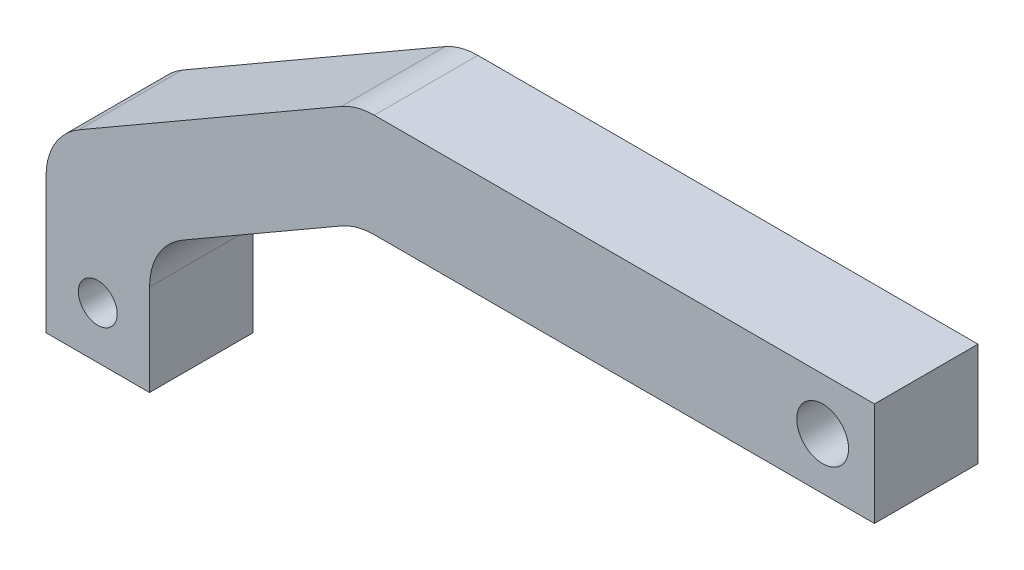
ISO-10303-21;
HEADER;
FILE_DESCRIPTION(('STEP AP214'),'2;1');
FILE_NAME('part.step','',(''),(''),'','','');
FILE_SCHEMA(('AUTOMOTIVE_DESIGN { 1 0 10303 214 1 1 1 1 }'));
ENDSEC;
DATA;
#1=APPLICATION_CONTEXT('core data for automotive mechanical design processes');
#2=APPLICATION_PROTOCOL_DEFINITION('international standard','automotive_design',2000,#1);
#3=PRODUCT_CONTEXT('',#1,'mechanical');
#4=PRODUCT('Part','Part','',(#3));
#5=PRODUCT_RELATED_PRODUCT_CATEGORY('part','',(#4));
#6=PRODUCT_DEFINITION_FORMATION('','',#4);
#7=PRODUCT_DEFINITION_CONTEXT('part definition',#1,'design');
#8=PRODUCT_DEFINITION('design','',#6,#7);
#9=PRODUCT_DEFINITION_SHAPE('','',#8);
#10=(LENGTH_UNIT() NAMED_UNIT(*) SI_UNIT(.MILLI.,.METRE.));
#11=(NAMED_UNIT(*) PLANE_ANGLE_UNIT() SI_UNIT($,.RADIAN.));
#12=(NAMED_UNIT(*) SI_UNIT($,.STERADIAN.) SOLID_ANGLE_UNIT());
#13=UNCERTAINTY_MEASURE_WITH_UNIT(LENGTH_MEASURE(1.E-05),#10,'distance_accuracy_value','');
#14=(GEOMETRIC_REPRESENTATION_CONTEXT(3) GLOBAL_UNCERTAINTY_ASSIGNED_CONTEXT((#13)) GLOBAL_UNIT_ASSIGNED_CONTEXT((#10,
#11,#12)) REPRESENTATION_CONTEXT('',''));
#15=CARTESIAN_POINT('',(0.,0.,0.));
#16=DIRECTION('',(0.,0.,1.));
#17=DIRECTION('',(1.,0.,0.));
#18=AXIS2_PLACEMENT_3D('',#15,#16,#17);
#19=CARTESIAN_POINT('',(-10.,0.,20.));
#20=DIRECTION('',(0.,1.,0.));
#21=DIRECTION('',(0.,0.,1.));
#22=AXIS2_PLACEMENT_3D('',#19,#20,#21);
#23=PLANE('',#22);
#24=DIRECTION('',(1.,0.,0.));
#25=VECTOR('',#24,1.);
#26=CARTESIAN_POINT('',(-10.,0.,0.));
#27=LINE('',#26,#25);
#28=CARTESIAN_POINT('',(-10.,0.,0.));
#29=VERTEX_POINT('',#28);
#30=CARTESIAN_POINT('',(10.,0.,0.));
#31=VERTEX_POINT('',#30);
#32=EDGE_CURVE('E146',#29,#31,#27,.T.);
#33=ORIENTED_EDGE('',*,*,#32,.T.);
#34=DIRECTION('',(0.,0.,-1.));
#35=VECTOR('',#34,1.);
#36=CARTESIAN_POINT('',(10.,0.,20.));
#37=LINE('',#36,#35);
#38=CARTESIAN_POINT('',(10.,0.,20.));
#39=VERTEX_POINT('',#38);
#40=EDGE_CURVE('E128',#39,#31,#37,.T.);
#41=ORIENTED_EDGE('',*,*,#40,.F.);
#42=DIRECTION('',(1.,0.,0.));
#43=VECTOR('',#42,1.);
#44=CARTESIAN_POINT('',(-10.,0.,20.));
#45=LINE('',#44,#43);
#46=CARTESIAN_POINT('',(-10.,0.,20.));
#47=VERTEX_POINT('',#46);
#48=EDGE_CURVE('E134',#47,#39,#45,.T.);
#49=ORIENTED_EDGE('',*,*,#48,.F.);
#50=DIRECTION('',(0.,0.,-1.));
#51=VECTOR('',#50,1.);
#52=CARTESIAN_POINT('',(-10.,0.,20.));
#53=LINE('',#52,#51);
#54=EDGE_CURVE('E207',#47,#29,#53,.T.);
#55=ORIENTED_EDGE('',*,*,#54,.T.);
#56=EDGE_LOOP('',(#33,#41,#49,#55));
#57=FACE_BOUND('',#56,.T.);
#58=ADVANCED_FACE('F34',(#57),#23,.F.);
#59=CARTESIAN_POINT('',(10.,0.,20.));
#60=DIRECTION('',(-1.,0.,0.));
#61=DIRECTION('',(0.,-1.,0.));
#62=AXIS2_PLACEMENT_3D('',#59,#60,#61);
#63=PLANE('',#62);
#64=DIRECTION('',(0.,1.,0.));
#65=VECTOR('',#64,1.);
#66=CARTESIAN_POINT('',(10.,0.,0.));
#67=LINE('',#66,#65);
#68=CARTESIAN_POINT('',(10.,17.6676515812917,0.));
#69=VERTEX_POINT('',#68);
#70=EDGE_CURVE('E186',#31,#69,#67,.T.);
#71=ORIENTED_EDGE('',*,*,#70,.T.);
#72=DIRECTION('',(0.,0.,-1.));
#73=VECTOR('',#72,1.);
#74=CARTESIAN_POINT('',(10.,17.6676515812917,20.));
#75=LINE('',#74,#73);
#76=CARTESIAN_POINT('',(10.,17.6676515812917,20.));
#77=VERTEX_POINT('',#76);
#78=EDGE_CURVE('E131',#69,#77,#75,.F.);
#79=ORIENTED_EDGE('',*,*,#78,.T.);
#80=DIRECTION('',(0.,1.,0.));
#81=VECTOR('',#80,1.);
#82=CARTESIAN_POINT('',(10.,0.,20.));
#83=LINE('',#82,#81);
#84=EDGE_CURVE('E123',#39,#77,#83,.T.);
#85=ORIENTED_EDGE('',*,*,#84,.F.);
#86=ORIENTED_EDGE('',*,*,#40,.T.);
#87=EDGE_LOOP('',(#71,#79,#85,#86));
#88=FACE_BOUND('',#87,.T.);
#89=ADVANCED_FACE('F126',(#88),#63,.F.);
#90=CARTESIAN_POINT('',(10.,25.,20.));
#91=DIRECTION('',(-0.499999999999998,0.86602540378444,0.));
#92=DIRECTION('',(-0.86602540378444,-0.499999999999998,0.));
#93=AXIS2_PLACEMENT_3D('',#90,#91,#92);
#94=PLANE('',#93);
#95=DIRECTION('',(0.86602540378444,0.499999999999998,0.));
#96=VECTOR('',#95,1.);
#97=CARTESIAN_POINT('',(10.,25.,0.));
#98=LINE('',#97,#96);
#99=CARTESIAN_POINT('',(16.35,28.6661742093541,0.));
#100=VERTEX_POINT('',#99);
#101=CARTESIAN_POINT('',(47.0529547438753,46.3925333956473,0.));
#102=VERTEX_POINT('',#101);
#103=EDGE_CURVE('E188',#100,#102,#98,.T.);
#104=ORIENTED_EDGE('',*,*,#103,.T.);
#105=DIRECTION('',(0.,0.,-1.));
#106=VECTOR('',#105,1.);
#107=CARTESIAN_POINT('',(47.0529547438753,46.3925333956473,20.));
#108=LINE('',#107,#106);
#109=CARTESIAN_POINT('',(47.0529547438753,46.3925333956473,20.));
#110=VERTEX_POINT('',#109);
#111=EDGE_CURVE('E177',#102,#110,#108,.F.);
#112=ORIENTED_EDGE('',*,*,#111,.T.);
#113=DIRECTION('',(0.86602540378444,0.499999999999998,0.));
#114=VECTOR('',#113,1.);
#115=CARTESIAN_POINT('',(10.,25.,20.));
#116=LINE('',#115,#114);
#117=CARTESIAN_POINT('',(16.35,28.6661742093541,20.));
#118=VERTEX_POINT('',#117);
#119=EDGE_CURVE('E133',#118,#110,#116,.T.);
#120=ORIENTED_EDGE('',*,*,#119,.F.);
#121=DIRECTION('',(0.,0.,-1.));
#122=VECTOR('',#121,1.);
#123=CARTESIAN_POINT('',(16.35,28.6661742093541,0.));
#124=LINE('',#123,#122);
#125=EDGE_CURVE('E174',#118,#100,#124,.T.);
#126=ORIENTED_EDGE('',*,*,#125,.T.);
#127=EDGE_LOOP('',(#104,#112,#120,#126));
#128=FACE_BOUND('',#127,.T.);
#129=ADVANCED_FACE('F194',(#128),#94,.F.);
#130=CARTESIAN_POINT('',(50.,48.0940107675849,20.));
#131=DIRECTION('',(0.,1.,0.));
#132=DIRECTION('',(-1.,0.,0.));
#133=AXIS2_PLACEMENT_3D('',#130,#131,#132);
#134=PLANE('',#133);
#135=DIRECTION('',(1.,0.,0.));
#136=VECTOR('',#135,1.);
#137=CARTESIAN_POINT('',(50.,48.0940107675849,20.));
#138=LINE('',#137,#136);
#139=CARTESIAN_POINT('',(53.4029547438752,48.0940107675849,20.));
#140=VERTEX_POINT('',#139);
#141=CARTESIAN_POINT('',(150.,48.0940107675849,20.));
#142=VERTEX_POINT('',#141);
#143=EDGE_CURVE('E196',#140,#142,#138,.T.);
#144=ORIENTED_EDGE('',*,*,#143,.F.);
#145=DIRECTION('',(0.,0.,-1.));
#146=VECTOR('',#145,1.);
#147=CARTESIAN_POINT('',(53.4029547438752,48.0940107675849,0.));
#148=LINE('',#147,#146);
#149=CARTESIAN_POINT('',(53.4029547438752,48.0940107675849,0.));
#150=VERTEX_POINT('',#149);
#151=EDGE_CURVE('E171',#140,#150,#148,.T.);
#152=ORIENTED_EDGE('',*,*,#151,.T.);
#153=DIRECTION('',(1.,0.,0.));
#154=VECTOR('',#153,1.);
#155=CARTESIAN_POINT('',(50.,48.0940107675849,0.));
#156=LINE('',#155,#154);
#157=CARTESIAN_POINT('',(150.,48.0940107675849,0.));
#158=VERTEX_POINT('',#157);
#159=EDGE_CURVE('E211',#150,#158,#156,.T.);
#160=ORIENTED_EDGE('',*,*,#159,.T.);
#161=DIRECTION('',(0.,0.,-1.));
#162=VECTOR('',#161,1.);
#163=CARTESIAN_POINT('',(150.,48.0940107675849,20.));
#164=LINE('',#163,#162);
#165=EDGE_CURVE('E148',#142,#158,#164,.T.);
#166=ORIENTED_EDGE('',*,*,#165,.F.);
#167=EDGE_LOOP('',(#144,#152,#160,#166));
#168=FACE_BOUND('',#167,.T.);
#169=ADVANCED_FACE('F277',(#168),#134,.F.);
#170=CARTESIAN_POINT('',(150.,48.0940107675849,20.));
#171=DIRECTION('',(-1.,0.,0.));
#172=DIRECTION('',(0.,0.,1.));
#173=AXIS2_PLACEMENT_3D('',#170,#171,#172);
#174=PLANE('',#173);
#175=DIRECTION('',(0.,1.,0.));
#176=VECTOR('',#175,1.);
#177=CARTESIAN_POINT('',(150.,48.0940107675849,0.));
#178=LINE('',#177,#176);
#179=CARTESIAN_POINT('',(150.,68.0940107675849,0.));
#180=VERTEX_POINT('',#179);
#181=EDGE_CURVE('E213',#158,#180,#178,.T.);
#182=ORIENTED_EDGE('',*,*,#181,.T.);
#183=DIRECTION('',(0.,0.,-1.));
#184=VECTOR('',#183,1.);
#185=CARTESIAN_POINT('',(150.,68.0940107675849,20.));
#186=LINE('',#185,#184);
#187=CARTESIAN_POINT('',(150.,68.0940107675849,20.));
#188=VERTEX_POINT('',#187);
#189=EDGE_CURVE('E153',#188,#180,#186,.T.);
#190=ORIENTED_EDGE('',*,*,#189,.F.);
#191=DIRECTION('',(0.,1.,0.));
#192=VECTOR('',#191,1.);
#193=CARTESIAN_POINT('',(150.,48.0940107675849,20.));
#194=LINE('',#193,#192);
#195=EDGE_CURVE('E198',#142,#188,#194,.T.);
#196=ORIENTED_EDGE('',*,*,#195,.F.);
#197=ORIENTED_EDGE('',*,*,#165,.T.);
#198=EDGE_LOOP('',(#182,#190,#196,#197));
#199=FACE_BOUND('',#198,.T.);
#200=ADVANCED_FACE('F279',(#199),#174,.F.);
#201=CARTESIAN_POINT('',(150.,68.0940107675849,20.));
#202=DIRECTION('',(0.,-1.,0.));
#203=DIRECTION('',(1.,0.,0.));
#204=AXIS2_PLACEMENT_3D('',#201,#202,#203);
#205=PLANE('',#204);
#206=DIRECTION('',(-1.,0.,0.));
#207=VECTOR('',#206,1.);
#208=CARTESIAN_POINT('',(150.,68.0940107675849,0.));
#209=LINE('',#208,#207);
#210=CARTESIAN_POINT('',(53.4029547438752,68.0940107675849,0.));
#211=VERTEX_POINT('',#210);
#212=EDGE_CURVE('E215',#180,#211,#209,.T.);
#213=ORIENTED_EDGE('',*,*,#212,.T.);
#214=DIRECTION('',(0.,0.,-1.));
#215=VECTOR('',#214,1.);
#216=CARTESIAN_POINT('',(53.4029547438752,68.0940107675849,20.));
#217=LINE('',#216,#215);
#218=CARTESIAN_POINT('',(53.4029547438752,68.0940107675849,20.));
#219=VERTEX_POINT('',#218);
#220=EDGE_CURVE('E163',#211,#219,#217,.F.);
#221=ORIENTED_EDGE('',*,*,#220,.T.);
#222=DIRECTION('',(-1.,0.,0.));
#223=VECTOR('',#222,1.);
#224=CARTESIAN_POINT('',(150.,68.0940107675849,20.));
#225=LINE('',#224,#223);
#226=EDGE_CURVE('E202',#188,#219,#225,.T.);
#227=ORIENTED_EDGE('',*,*,#226,.F.);
#228=ORIENTED_EDGE('',*,*,#189,.T.);
#229=EDGE_LOOP('',(#213,#221,#227,#228));
#230=FACE_BOUND('',#229,.T.);
#231=ADVANCED_FACE('F227',(#230),#205,.F.);
#232=CARTESIAN_POINT('',(50.,68.0940107675849,20.));
#233=DIRECTION('',(0.499999999999998,-0.86602540378444,0.));
#234=DIRECTION('',(0.86602540378444,0.499999999999998,0.));
#235=AXIS2_PLACEMENT_3D('',#232,#233,#234);
#236=PLANE('',#235);
#237=DIRECTION('',(-0.86602540378444,-0.499999999999998,0.));
#238=VECTOR('',#237,1.);
#239=CARTESIAN_POINT('',(50.,68.0940107675849,20.));
#240=LINE('',#239,#238);
#241=CARTESIAN_POINT('',(47.0529547438753,66.3925333956473,20.));
#242=VERTEX_POINT('',#241);
#243=CARTESIAN_POINT('',(-3.64999999999997,37.1191688255617,20.));
#244=VERTEX_POINT('',#243);
#245=EDGE_CURVE('E204',#242,#244,#240,.T.);
#246=ORIENTED_EDGE('',*,*,#245,.F.);
#247=DIRECTION('',(0.,0.,-1.));
#248=VECTOR('',#247,1.);
#249=CARTESIAN_POINT('',(47.0529547438753,66.3925333956473,20.));
#250=LINE('',#249,#248);
#251=CARTESIAN_POINT('',(47.0529547438753,66.3925333956473,0.));
#252=VERTEX_POINT('',#251);
#253=EDGE_CURVE('E150',#242,#252,#250,.T.);
#254=ORIENTED_EDGE('',*,*,#253,.T.);
#255=DIRECTION('',(-0.86602540378444,-0.499999999999998,0.));
#256=VECTOR('',#255,1.);
#257=CARTESIAN_POINT('',(50.,68.0940107675849,0.));
#258=LINE('',#257,#256);
#259=CARTESIAN_POINT('',(-3.64999999999997,37.1191688255617,0.));
#260=VERTEX_POINT('',#259);
#261=EDGE_CURVE('E218',#252,#260,#258,.T.);
#262=ORIENTED_EDGE('',*,*,#261,.T.);
#263=DIRECTION('',(0.,0.,-1.));
#264=VECTOR('',#263,1.);
#265=CARTESIAN_POINT('',(-3.64999999999997,37.1191688255617,20.));
#266=LINE('',#265,#264);
#267=EDGE_CURVE('E147',#260,#244,#266,.F.);
#268=ORIENTED_EDGE('',*,*,#267,.T.);
#269=EDGE_LOOP('',(#246,#254,#262,#268));
#270=FACE_BOUND('',#269,.T.);
#271=ADVANCED_FACE('F239',(#270),#236,.F.);
#272=CARTESIAN_POINT('',(-10.,33.4529946162075,20.));
#273=DIRECTION('',(1.,0.,0.));
#274=DIRECTION('',(0.,1.,0.));
#275=AXIS2_PLACEMENT_3D('',#272,#273,#274);
#276=PLANE('',#275);
#277=DIRECTION('',(0.,-1.,0.));
#278=VECTOR('',#277,1.);
#279=CARTESIAN_POINT('',(-10.,33.4529946162075,20.));
#280=LINE('',#279,#278);
#281=CARTESIAN_POINT('',(-10.,26.1206461974993,20.));
#282=VERTEX_POINT('',#281);
#283=EDGE_CURVE('E139',#282,#47,#280,.T.);
#284=ORIENTED_EDGE('',*,*,#283,.F.);
#285=DIRECTION('',(0.,0.,-1.));
#286=VECTOR('',#285,1.);
#287=CARTESIAN_POINT('',(-10.,26.1206461974993,20.));
#288=LINE('',#287,#286);
#289=CARTESIAN_POINT('',(-10.,26.1206461974993,0.));
#290=VERTEX_POINT('',#289);
#291=EDGE_CURVE('E168',#282,#290,#288,.T.);
#292=ORIENTED_EDGE('',*,*,#291,.T.);
#293=DIRECTION('',(0.,-1.,0.));
#294=VECTOR('',#293,1.);
#295=CARTESIAN_POINT('',(-10.,33.4529946162075,0.));
#296=LINE('',#295,#294);
#297=EDGE_CURVE('E143',#290,#29,#296,.T.);
#298=ORIENTED_EDGE('',*,*,#297,.T.);
#299=ORIENTED_EDGE('',*,*,#54,.F.);
#300=EDGE_LOOP('',(#284,#292,#298,#299));
#301=FACE_BOUND('',#300,.T.);
#302=ADVANCED_FACE('F246',(#301),#276,.F.);
#303=CARTESIAN_POINT('',(0.,0.,20.));
#304=DIRECTION('',(0.,0.,1.));
#305=DIRECTION('',(1.,0.,0.));
#306=AXIS2_PLACEMENT_3D('',#303,#304,#305);
#307=PLANE('',#306);
#308=CARTESIAN_POINT('',(0.,10.,20.));
#309=DIRECTION('',(0.,0.,1.));
#310=DIRECTION('',(1.,0.,0.));
#311=AXIS2_PLACEMENT_3D('',#308,#309,#310);
#312=CIRCLE('',#311,3.75);
#313=CARTESIAN_POINT('',(3.75,10.,20.));
#314=VERTEX_POINT('',#313);
#315=EDGE_CURVE('E379',#314,#314,#312,.T.);
#316=ORIENTED_EDGE('',*,*,#315,.F.);
#317=EDGE_LOOP('',(#316));
#318=FACE_BOUND('',#317,.T.);
#319=CARTESIAN_POINT('',(140.,58.0940107675849,20.));
#320=DIRECTION('',(0.,0.,1.));
#321=DIRECTION('',(1.,0.,0.));
#322=AXIS2_PLACEMENT_3D('',#319,#320,#321);
#323=CIRCLE('',#322,4.99999999999999);
#324=CARTESIAN_POINT('',(145.,58.0940107675849,20.));
#325=VERTEX_POINT('',#324);
#326=EDGE_CURVE('E381',#325,#325,#323,.T.);
#327=ORIENTED_EDGE('',*,*,#326,.F.);
#328=EDGE_LOOP('',(#327));
#329=FACE_BOUND('',#328,.T.);
#330=ORIENTED_EDGE('',*,*,#226,.T.);
#331=CARTESIAN_POINT('',(53.4029547438752,55.3940107675849,20.));
#332=DIRECTION('',(0.,0.,1.));
#333=DIRECTION('',(1.,0.,0.));
#334=AXIS2_PLACEMENT_3D('',#331,#332,#333);
#335=CIRCLE('',#334,12.7);
#336=EDGE_CURVE('E166',#219,#242,#335,.T.);
#337=ORIENTED_EDGE('',*,*,#336,.T.);
#338=ORIENTED_EDGE('',*,*,#245,.T.);
#339=CARTESIAN_POINT('',(2.7,26.1206461974993,20.));
#340=DIRECTION('',(0.,0.,1.));
#341=DIRECTION('',(1.,0.,0.));
#342=AXIS2_PLACEMENT_3D('',#339,#340,#341);
#343=CIRCLE('',#342,12.7);
#344=EDGE_CURVE('E49',#244,#282,#343,.T.);
#345=ORIENTED_EDGE('',*,*,#344,.T.);
#346=ORIENTED_EDGE('',*,*,#283,.T.);
#347=ORIENTED_EDGE('',*,*,#48,.T.);
#348=ORIENTED_EDGE('',*,*,#84,.T.);
#349=CARTESIAN_POINT('',(22.7,17.6676515812917,20.));
#350=DIRECTION('',(0.,0.,1.));
#351=DIRECTION('',(1.,0.,0.));
#352=AXIS2_PLACEMENT_3D('',#349,#350,#351);
#353=CIRCLE('',#352,12.7);
#354=EDGE_CURVE('E11',#77,#118,#353,.F.);
#355=ORIENTED_EDGE('',*,*,#354,.T.);
#356=ORIENTED_EDGE('',*,*,#119,.T.);
#357=CARTESIAN_POINT('',(53.4029547438752,35.3940107675849,20.));
#358=DIRECTION('',(0.,0.,1.));
#359=DIRECTION('',(1.,0.,0.));
#360=AXIS2_PLACEMENT_3D('',#357,#358,#359);
#361=CIRCLE('',#360,12.7);
#362=EDGE_CURVE('E56',#110,#140,#361,.F.);
#363=ORIENTED_EDGE('',*,*,#362,.T.);
#364=ORIENTED_EDGE('',*,*,#143,.T.);
#365=ORIENTED_EDGE('',*,*,#195,.T.);
#366=EDGE_LOOP('',(#330,#337,#338,#345,#346,#347,#348,#355,#356,#363,#364,#365));
#367=FACE_BOUND('',#366,.T.);
#368=ADVANCED_FACE('F138',(#318,#329,#367),#307,.T.);
#369=CARTESIAN_POINT('',(0.,0.,0.));
#370=DIRECTION('',(0.,0.,1.));
#371=DIRECTION('',(1.,0.,0.));
#372=AXIS2_PLACEMENT_3D('',#369,#370,#371);
#373=PLANE('',#372);
#374=CARTESIAN_POINT('',(0.,10.,0.));
#375=DIRECTION('',(0.,0.,1.));
#376=DIRECTION('',(1.,0.,0.));
#377=AXIS2_PLACEMENT_3D('',#374,#375,#376);
#378=CIRCLE('',#377,3.75);
#379=CARTESIAN_POINT('',(3.75,10.,0.));
#380=VERTEX_POINT('',#379);
#381=EDGE_CURVE('E376',#380,#380,#378,.T.);
#382=ORIENTED_EDGE('',*,*,#381,.T.);
#383=EDGE_LOOP('',(#382));
#384=FACE_BOUND('',#383,.T.);
#385=CARTESIAN_POINT('',(140.,58.0940107675849,0.));
#386=DIRECTION('',(0.,0.,1.));
#387=DIRECTION('',(1.,0.,0.));
#388=AXIS2_PLACEMENT_3D('',#385,#386,#387);
#389=CIRCLE('',#388,4.99999999999999);
#390=CARTESIAN_POINT('',(145.,58.0940107675849,0.));
#391=VERTEX_POINT('',#390);
#392=EDGE_CURVE('E208',#391,#391,#389,.T.);
#393=ORIENTED_EDGE('',*,*,#392,.T.);
#394=EDGE_LOOP('',(#393));
#395=FACE_BOUND('',#394,.T.);
#396=ORIENTED_EDGE('',*,*,#261,.F.);
#397=CARTESIAN_POINT('',(53.4029547438752,55.3940107675849,0.));
#398=DIRECTION('',(0.,0.,1.));
#399=DIRECTION('',(1.,0.,0.));
#400=AXIS2_PLACEMENT_3D('',#397,#398,#399);
#401=CIRCLE('',#400,12.7);
#402=EDGE_CURVE('E161',#252,#211,#401,.F.);
#403=ORIENTED_EDGE('',*,*,#402,.T.);
#404=ORIENTED_EDGE('',*,*,#212,.F.);
#405=ORIENTED_EDGE('',*,*,#181,.F.);
#406=ORIENTED_EDGE('',*,*,#159,.F.);
#407=CARTESIAN_POINT('',(53.4029547438752,35.3940107675849,0.));
#408=DIRECTION('',(0.,0.,1.));
#409=DIRECTION('',(1.,0.,0.));
#410=AXIS2_PLACEMENT_3D('',#407,#408,#409);
#411=CIRCLE('',#410,12.7);
#412=EDGE_CURVE('E180',#150,#102,#411,.T.);
#413=ORIENTED_EDGE('',*,*,#412,.T.);
#414=ORIENTED_EDGE('',*,*,#103,.F.);
#415=CARTESIAN_POINT('',(22.7,17.6676515812917,0.));
#416=DIRECTION('',(0.,0.,1.));
#417=DIRECTION('',(1.,0.,0.));
#418=AXIS2_PLACEMENT_3D('',#415,#416,#417);
#419=CIRCLE('',#418,12.7);
#420=EDGE_CURVE('E42',#100,#69,#419,.T.);
#421=ORIENTED_EDGE('',*,*,#420,.T.);
#422=ORIENTED_EDGE('',*,*,#70,.F.);
#423=ORIENTED_EDGE('',*,*,#32,.F.);
#424=ORIENTED_EDGE('',*,*,#297,.F.);
#425=CARTESIAN_POINT('',(2.7,26.1206461974993,0.));
#426=DIRECTION('',(0.,0.,1.));
#427=DIRECTION('',(1.,0.,0.));
#428=AXIS2_PLACEMENT_3D('',#425,#426,#427);
#429=CIRCLE('',#428,12.7);
#430=EDGE_CURVE('E159',#290,#260,#429,.F.);
#431=ORIENTED_EDGE('',*,*,#430,.T.);
#432=EDGE_LOOP('',(#396,#403,#404,#405,#406,#413,#414,#421,#422,#423,#424,#431));
#433=FACE_BOUND('',#432,.T.);
#434=ADVANCED_FACE('F185',(#384,#395,#433),#373,.F.);
#435=CARTESIAN_POINT('',(53.4029547438752,55.3940107675849,20.));
#436=DIRECTION('',(0.,0.,-1.));
#437=DIRECTION('',(-1.,0.,0.));
#438=AXIS2_PLACEMENT_3D('',#435,#436,#437);
#439=CYLINDRICAL_SURFACE('',#438,12.7);
#440=ORIENTED_EDGE('',*,*,#336,.F.);
#441=ORIENTED_EDGE('',*,*,#220,.F.);
#442=ORIENTED_EDGE('',*,*,#402,.F.);
#443=ORIENTED_EDGE('',*,*,#253,.F.);
#444=EDGE_LOOP('',(#440,#441,#442,#443));
#445=FACE_BOUND('',#444,.T.);
#446=ADVANCED_FACE('F236',(#445),#439,.T.);
#447=CARTESIAN_POINT('',(2.7,26.1206461974993,20.));
#448=DIRECTION('',(0.,0.,-1.));
#449=DIRECTION('',(-1.,0.,0.));
#450=AXIS2_PLACEMENT_3D('',#447,#448,#449);
#451=CYLINDRICAL_SURFACE('',#450,12.7);
#452=ORIENTED_EDGE('',*,*,#344,.F.);
#453=ORIENTED_EDGE('',*,*,#267,.F.);
#454=ORIENTED_EDGE('',*,*,#430,.F.);
#455=ORIENTED_EDGE('',*,*,#291,.F.);
#456=EDGE_LOOP('',(#452,#453,#454,#455));
#457=FACE_BOUND('',#456,.T.);
#458=ADVANCED_FACE('F243',(#457),#451,.T.);
#459=CARTESIAN_POINT('',(53.4029547438752,35.3940107675849,20.));
#460=DIRECTION('',(0.,0.,1.));
#461=DIRECTION('',(1.,0.,0.));
#462=AXIS2_PLACEMENT_3D('',#459,#460,#461);
#463=CYLINDRICAL_SURFACE('',#462,12.7);
#464=ORIENTED_EDGE('',*,*,#362,.F.);
#465=ORIENTED_EDGE('',*,*,#111,.F.);
#466=ORIENTED_EDGE('',*,*,#412,.F.);
#467=ORIENTED_EDGE('',*,*,#151,.F.);
#468=EDGE_LOOP('',(#464,#465,#466,#467));
#469=FACE_BOUND('',#468,.T.);
#470=ADVANCED_FACE('F268',(#469),#463,.F.);
#471=CARTESIAN_POINT('',(22.7,17.6676515812917,20.));
#472=DIRECTION('',(0.,0.,1.));
#473=DIRECTION('',(1.,0.,0.));
#474=AXIS2_PLACEMENT_3D('',#471,#472,#473);
#475=CYLINDRICAL_SURFACE('',#474,12.7);
#476=ORIENTED_EDGE('',*,*,#354,.F.);
#477=ORIENTED_EDGE('',*,*,#78,.F.);
#478=ORIENTED_EDGE('',*,*,#420,.F.);
#479=ORIENTED_EDGE('',*,*,#125,.F.);
#480=EDGE_LOOP('',(#476,#477,#478,#479));
#481=FACE_BOUND('',#480,.T.);
#482=ADVANCED_FACE('F36',(#481),#475,.F.);
#483=CARTESIAN_POINT('',(140.,58.0940107675849,0.));
#484=DIRECTION('',(0.,0.,1.));
#485=DIRECTION('',(1.,0.,0.));
#486=AXIS2_PLACEMENT_3D('',#483,#484,#485);
#487=CYLINDRICAL_SURFACE('',#486,4.99999999999999);
#488=ORIENTED_EDGE('',*,*,#392,.F.);
#489=EDGE_LOOP('',(#488));
#490=FACE_BOUND('',#489,.T.);
#491=ORIENTED_EDGE('',*,*,#326,.T.);
#492=EDGE_LOOP('',(#491));
#493=FACE_BOUND('',#492,.T.);
#494=ADVANCED_FACE('F274',(#490,#493),#487,.F.);
#495=CARTESIAN_POINT('',(0.,10.,0.));
#496=DIRECTION('',(0.,0.,1.));
#497=DIRECTION('',(1.,0.,0.));
#498=AXIS2_PLACEMENT_3D('',#495,#496,#497);
#499=CYLINDRICAL_SURFACE('',#498,3.75);
#500=ORIENTED_EDGE('',*,*,#381,.F.);
#501=EDGE_LOOP('',(#500));
#502=FACE_BOUND('',#501,.T.);
#503=ORIENTED_EDGE('',*,*,#315,.T.);
#504=EDGE_LOOP('',(#503));
#505=FACE_BOUND('',#504,.T.);
#506=ADVANCED_FACE('F359',(#502,#505),#499,.F.);
#507=CLOSED_SHELL('',(#58,#89,#129,#169,#200,#231,#271,#302,#368,#434,#446,#458,#470,#482,#494,#506));
#508=MANIFOLD_SOLID_BREP('B2',#507);
#509=ADVANCED_BREP_SHAPE_REPRESENTATION('',(#18,#508),#14);
#510=SHAPE_DEFINITION_REPRESENTATION(#9,#509);
ENDSEC;
END-ISO-10303-21;
